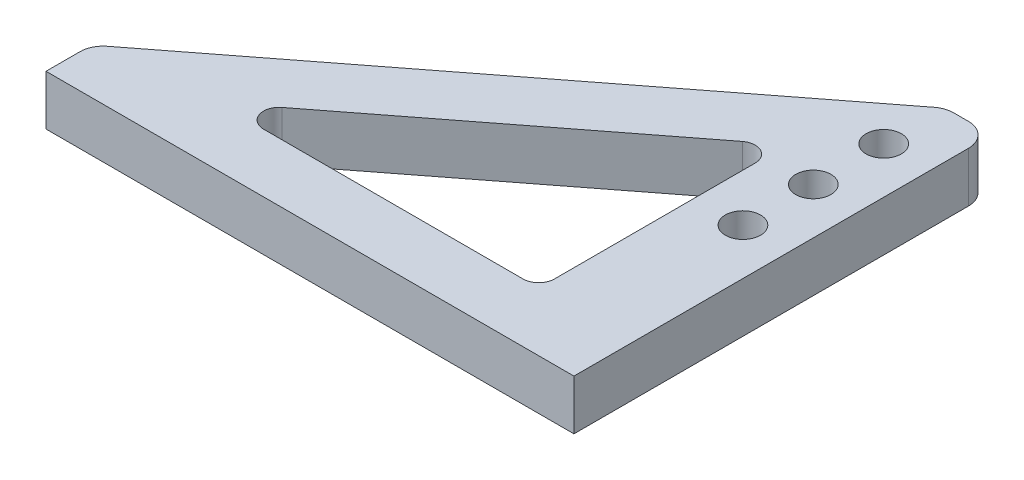
ISO-10303-21;
HEADER;
FILE_DESCRIPTION(('STEP AP214'),'2;1');
FILE_NAME('part.step','',(''),(''),'','','');
FILE_SCHEMA(('AUTOMOTIVE_DESIGN { 1 0 10303 214 1 1 1 1 }'));
ENDSEC;
DATA;
#1=APPLICATION_CONTEXT('core data for automotive mechanical design processes');
#2=APPLICATION_PROTOCOL_DEFINITION('international standard','automotive_design',2000,#1);
#3=PRODUCT_CONTEXT('',#1,'mechanical');
#4=PRODUCT('Part','Part','',(#3));
#5=PRODUCT_RELATED_PRODUCT_CATEGORY('part','',(#4));
#6=PRODUCT_DEFINITION_FORMATION('','',#4);
#7=PRODUCT_DEFINITION_CONTEXT('part definition',#1,'design');
#8=PRODUCT_DEFINITION('design','',#6,#7);
#9=PRODUCT_DEFINITION_SHAPE('','',#8);
#10=(LENGTH_UNIT() NAMED_UNIT(*) SI_UNIT(.MILLI.,.METRE.));
#11=(NAMED_UNIT(*) PLANE_ANGLE_UNIT() SI_UNIT($,.RADIAN.));
#12=(NAMED_UNIT(*) SI_UNIT($,.STERADIAN.) SOLID_ANGLE_UNIT());
#13=UNCERTAINTY_MEASURE_WITH_UNIT(LENGTH_MEASURE(1.E-05),#10,'distance_accuracy_value','');
#14=(GEOMETRIC_REPRESENTATION_CONTEXT(3) GLOBAL_UNCERTAINTY_ASSIGNED_CONTEXT((#13)) GLOBAL_UNIT_ASSIGNED_CONTEXT((#10,
#11,#12)) REPRESENTATION_CONTEXT('',''));
#15=CARTESIAN_POINT('',(0.,0.,0.));
#16=DIRECTION('',(0.,0.,1.));
#17=DIRECTION('',(1.,0.,0.));
#18=AXIS2_PLACEMENT_3D('',#15,#16,#17);
#19=CARTESIAN_POINT('',(19.05,1.6256,-13.5703377589833));
#20=DIRECTION('',(0.,-1.,0.));
#21=DIRECTION('',(0.,0.,-1.));
#22=AXIS2_PLACEMENT_3D('',#19,#20,#21);
#23=PLANE('',#22);
#24=CARTESIAN_POINT('',(17.5478505504094,1.6256,-9.27621674119706));
#25=DIRECTION('',(0.,1.,0.));
#26=DIRECTION('',(0.,0.,1.));
#27=AXIS2_PLACEMENT_3D('',#24,#25,#26);
#28=CIRCLE('',#27,0.571499999999999);
#29=CARTESIAN_POINT('',(17.5478505504094,1.6256,-8.70471674119706));
#30=VERTEX_POINT('',#29);
#31=EDGE_CURVE('E263',#30,#30,#28,.T.);
#32=ORIENTED_EDGE('',*,*,#31,.F.);
#33=EDGE_LOOP('',(#32));
#34=FACE_BOUND('',#33,.T.);
#35=DIRECTION('',(-0.791052984112555,0.,0.611747641047043));
#36=VECTOR('',#35,1.);
#37=CARTESIAN_POINT('',(5.57739124076499,1.6256,-1.905));
#38=LINE('',#37,#36);
#39=CARTESIAN_POINT('',(15.1832321983481,1.6256,-9.33351700719761));
#40=VERTEX_POINT('',#39);
#41=CARTESIAN_POINT('',(6.75392776998375,1.6256,-2.81485491592918));
#42=VERTEX_POINT('',#41);
#43=EDGE_CURVE('E245',#40,#42,#38,.T.);
#44=ORIENTED_EDGE('',*,*,#43,.F.);
#45=CARTESIAN_POINT('',(15.494,1.6256,-8.93166209126843));
#46=DIRECTION('',(0.,-1.,0.));
#47=DIRECTION('',(0.,0.,-1.));
#48=AXIS2_PLACEMENT_3D('',#45,#46,#47);
#49=CIRCLE('',#48,0.508);
#50=CARTESIAN_POINT('',(16.002,1.6256,-8.93166209126843));
#51=VERTEX_POINT('',#50);
#52=EDGE_CURVE('E200',#40,#51,#49,.T.);
#53=ORIENTED_EDGE('',*,*,#52,.T.);
#54=DIRECTION('',(0.,0.,-1.));
#55=VECTOR('',#54,1.);
#56=CARTESIAN_POINT('',(16.002,1.6256,-1.905));
#57=LINE('',#56,#55);
#58=CARTESIAN_POINT('',(16.002,1.6256,-2.413));
#59=VERTEX_POINT('',#58);
#60=EDGE_CURVE('E167',#59,#51,#57,.T.);
#61=ORIENTED_EDGE('',*,*,#60,.F.);
#62=CARTESIAN_POINT('',(15.494,1.6256,-2.413));
#63=DIRECTION('',(0.,-1.,0.));
#64=DIRECTION('',(0.,0.,-1.));
#65=AXIS2_PLACEMENT_3D('',#62,#63,#64);
#66=CIRCLE('',#65,0.508);
#67=CARTESIAN_POINT('',(15.494,1.6256,-1.905));
#68=VERTEX_POINT('',#67);
#69=EDGE_CURVE('E196',#59,#68,#66,.T.);
#70=ORIENTED_EDGE('',*,*,#69,.T.);
#71=DIRECTION('',(1.,0.,0.));
#72=VECTOR('',#71,1.);
#73=CARTESIAN_POINT('',(5.57739124076499,1.6256,-1.905));
#74=LINE('',#73,#72);
#75=CARTESIAN_POINT('',(7.06469557163565,1.6256,-1.905));
#76=VERTEX_POINT('',#75);
#77=EDGE_CURVE('E255',#76,#68,#74,.T.);
#78=ORIENTED_EDGE('',*,*,#77,.F.);
#79=CARTESIAN_POINT('',(7.06469557163565,1.6256,-2.413));
#80=DIRECTION('',(0.,-1.,0.));
#81=DIRECTION('',(0.,0.,-1.));
#82=AXIS2_PLACEMENT_3D('',#79,#80,#81);
#83=CIRCLE('',#82,0.508);
#84=EDGE_CURVE('E192',#76,#42,#83,.T.);
#85=ORIENTED_EDGE('',*,*,#84,.T.);
#86=EDGE_LOOP('',(#44,#53,#61,#70,#78,#85));
#87=FACE_BOUND('',#86,.T.);
#88=DIRECTION('',(-0.791052984112555,0.,0.611747641047043));
#89=VECTOR('',#88,1.);
#90=CARTESIAN_POINT('',(1.905,1.6256,-1.4732));
#91=LINE('',#90,#89);
#92=CARTESIAN_POINT('',(17.3419656890651,1.6256,-13.411120132877));
#93=VERTEX_POINT('',#92);
#94=CARTESIAN_POINT('',(2.20084829752215,1.6256,-1.7019893500838));
#95=VERTEX_POINT('',#94);
#96=EDGE_CURVE('E144',#93,#95,#91,.T.);
#97=ORIENTED_EDGE('',*,*,#96,.T.);
#98=CARTESIAN_POINT('',(2.667,1.6256,-1.09920697619003));
#99=DIRECTION('',(0.,-1.,0.));
#100=DIRECTION('',(0.,0.,-1.));
#101=AXIS2_PLACEMENT_3D('',#98,#99,#100);
#102=CIRCLE('',#101,0.762);
#103=CARTESIAN_POINT('',(1.905,1.6256,-1.09920697619003));
#104=VERTEX_POINT('',#103);
#105=EDGE_CURVE('E140',#95,#104,#102,.F.);
#106=ORIENTED_EDGE('',*,*,#105,.T.);
#107=DIRECTION('',(0.,0.,1.));
#108=VECTOR('',#107,1.);
#109=CARTESIAN_POINT('',(1.905,1.6256,0.));
#110=LINE('',#109,#108);
#111=CARTESIAN_POINT('',(1.905,1.6256,0.));
#112=VERTEX_POINT('',#111);
#113=EDGE_CURVE('E132',#104,#112,#110,.T.);
#114=ORIENTED_EDGE('',*,*,#113,.T.);
#115=DIRECTION('',(1.,0.,0.));
#116=VECTOR('',#115,1.);
#117=CARTESIAN_POINT('',(1.905,1.6256,0.));
#118=LINE('',#117,#116);
#119=CARTESIAN_POINT('',(19.05,1.6256,0.));
#120=VERTEX_POINT('',#119);
#121=EDGE_CURVE('E137',#112,#120,#118,.T.);
#122=ORIENTED_EDGE('',*,*,#121,.T.);
#123=DIRECTION('',(0.,0.,-1.));
#124=VECTOR('',#123,1.);
#125=CARTESIAN_POINT('',(19.05,1.6256,0.));
#126=LINE('',#125,#124);
#127=CARTESIAN_POINT('',(19.05,1.6256,-12.8083377589833));
#128=VERTEX_POINT('',#127);
#129=EDGE_CURVE('E174',#120,#128,#126,.T.);
#130=ORIENTED_EDGE('',*,*,#129,.T.);
#131=CARTESIAN_POINT('',(18.288,1.6256,-12.8083377589833));
#132=DIRECTION('',(0.,-1.,0.));
#133=DIRECTION('',(0.,0.,-1.));
#134=AXIS2_PLACEMENT_3D('',#131,#132,#133);
#135=CIRCLE('',#134,0.762);
#136=CARTESIAN_POINT('',(18.288,1.6256,-13.5703377589833));
#137=VERTEX_POINT('',#136);
#138=EDGE_CURVE('E54',#128,#137,#135,.F.);
#139=ORIENTED_EDGE('',*,*,#138,.T.);
#140=DIRECTION('',(-1.,0.,0.));
#141=VECTOR('',#140,1.);
#142=CARTESIAN_POINT('',(17.5478505504094,1.6256,-13.5703377589833));
#143=LINE('',#142,#141);
#144=CARTESIAN_POINT('',(17.808117391543,1.6256,-13.5703377589833));
#145=VERTEX_POINT('',#144);
#146=EDGE_CURVE('E224',#137,#145,#143,.T.);
#147=ORIENTED_EDGE('',*,*,#146,.T.);
#148=CARTESIAN_POINT('',(17.808117391543,1.6256,-12.8083377589833));
#149=DIRECTION('',(0.,-1.,0.));
#150=DIRECTION('',(0.,0.,-1.));
#151=AXIS2_PLACEMENT_3D('',#148,#149,#150);
#152=CIRCLE('',#151,0.762);
#153=EDGE_CURVE('E216',#145,#93,#152,.F.);
#154=ORIENTED_EDGE('',*,*,#153,.T.);
#155=EDGE_LOOP('',(#97,#106,#114,#122,#130,#139,#147,#154));
#156=FACE_BOUND('',#155,.T.);
#157=CARTESIAN_POINT('',(17.5478505504094,1.6256,-11.5622167411971));
#158=DIRECTION('',(0.,1.,0.));
#159=DIRECTION('',(0.,0.,1.));
#160=AXIS2_PLACEMENT_3D('',#157,#158,#159);
#161=CIRCLE('',#160,0.571499999999999);
#162=CARTESIAN_POINT('',(17.5478505504094,1.6256,-10.9907167411971));
#163=VERTEX_POINT('',#162);
#164=EDGE_CURVE('E252',#163,#163,#161,.T.);
#165=ORIENTED_EDGE('',*,*,#164,.F.);
#166=EDGE_LOOP('',(#165));
#167=FACE_BOUND('',#166,.T.);
#168=CARTESIAN_POINT('',(17.5478505504094,1.6256,-6.99021674119706));
#169=DIRECTION('',(0.,1.,0.));
#170=DIRECTION('',(0.,0.,1.));
#171=AXIS2_PLACEMENT_3D('',#168,#169,#170);
#172=CIRCLE('',#171,0.571499999999999);
#173=CARTESIAN_POINT('',(17.5478505504094,1.6256,-6.41871674119706));
#174=VERTEX_POINT('',#173);
#175=EDGE_CURVE('E269',#174,#174,#172,.T.);
#176=ORIENTED_EDGE('',*,*,#175,.F.);
#177=EDGE_LOOP('',(#176));
#178=FACE_BOUND('',#177,.T.);
#179=ADVANCED_FACE('F33',(#34,#87,#156,#167,#178),#23,.F.);
#180=CARTESIAN_POINT('',(19.05,0.,-13.5703377589833));
#181=DIRECTION('',(0.,-1.,0.));
#182=DIRECTION('',(0.,0.,-1.));
#183=AXIS2_PLACEMENT_3D('',#180,#181,#182);
#184=PLANE('',#183);
#185=CARTESIAN_POINT('',(17.5478505504094,0.,-9.27621674119706));
#186=DIRECTION('',(0.,1.,0.));
#187=DIRECTION('',(0.,0.,1.));
#188=AXIS2_PLACEMENT_3D('',#185,#186,#187);
#189=CIRCLE('',#188,0.571499999999999);
#190=CARTESIAN_POINT('',(17.5478505504094,0.,-8.70471674119706));
#191=VERTEX_POINT('',#190);
#192=EDGE_CURVE('E266',#191,#191,#189,.T.);
#193=ORIENTED_EDGE('',*,*,#192,.T.);
#194=EDGE_LOOP('',(#193));
#195=FACE_BOUND('',#194,.T.);
#196=DIRECTION('',(1.,0.,0.));
#197=VECTOR('',#196,1.);
#198=CARTESIAN_POINT('',(5.57739124076499,0.,-1.905));
#199=LINE('',#198,#197);
#200=CARTESIAN_POINT('',(7.06469557163565,0.,-1.905));
#201=VERTEX_POINT('',#200);
#202=CARTESIAN_POINT('',(15.494,0.,-1.905));
#203=VERTEX_POINT('',#202);
#204=EDGE_CURVE('E246',#201,#203,#199,.T.);
#205=ORIENTED_EDGE('',*,*,#204,.T.);
#206=CARTESIAN_POINT('',(15.494,0.,-2.413));
#207=DIRECTION('',(0.,-1.,0.));
#208=DIRECTION('',(0.,0.,-1.));
#209=AXIS2_PLACEMENT_3D('',#206,#207,#208);
#210=CIRCLE('',#209,0.508);
#211=CARTESIAN_POINT('',(16.002,0.,-2.413));
#212=VERTEX_POINT('',#211);
#213=EDGE_CURVE('E194',#203,#212,#210,.F.);
#214=ORIENTED_EDGE('',*,*,#213,.T.);
#215=DIRECTION('',(0.,0.,-1.));
#216=VECTOR('',#215,1.);
#217=CARTESIAN_POINT('',(16.002,0.,-1.905));
#218=LINE('',#217,#216);
#219=CARTESIAN_POINT('',(16.002,0.,-8.93166209126843));
#220=VERTEX_POINT('',#219);
#221=EDGE_CURVE('E242',#212,#220,#218,.T.);
#222=ORIENTED_EDGE('',*,*,#221,.T.);
#223=CARTESIAN_POINT('',(15.494,0.,-8.93166209126843));
#224=DIRECTION('',(0.,-1.,0.));
#225=DIRECTION('',(0.,0.,-1.));
#226=AXIS2_PLACEMENT_3D('',#223,#224,#225);
#227=CIRCLE('',#226,0.508);
#228=CARTESIAN_POINT('',(15.1832321983481,0.,-9.33351700719761));
#229=VERTEX_POINT('',#228);
#230=EDGE_CURVE('E198',#220,#229,#227,.F.);
#231=ORIENTED_EDGE('',*,*,#230,.T.);
#232=DIRECTION('',(-0.791052984112555,0.,0.611747641047043));
#233=VECTOR('',#232,1.);
#234=CARTESIAN_POINT('',(5.57739124076499,0.,-1.905));
#235=LINE('',#234,#233);
#236=CARTESIAN_POINT('',(6.75392776998375,0.,-2.81485491592918));
#237=VERTEX_POINT('',#236);
#238=EDGE_CURVE('E249',#229,#237,#235,.T.);
#239=ORIENTED_EDGE('',*,*,#238,.T.);
#240=CARTESIAN_POINT('',(7.06469557163565,0.,-2.413));
#241=DIRECTION('',(0.,-1.,0.));
#242=DIRECTION('',(0.,0.,-1.));
#243=AXIS2_PLACEMENT_3D('',#240,#241,#242);
#244=CIRCLE('',#243,0.508);
#245=EDGE_CURVE('E190',#237,#201,#244,.F.);
#246=ORIENTED_EDGE('',*,*,#245,.T.);
#247=EDGE_LOOP('',(#205,#214,#222,#231,#239,#246));
#248=FACE_BOUND('',#247,.T.);
#249=DIRECTION('',(0.,0.,1.));
#250=VECTOR('',#249,1.);
#251=CARTESIAN_POINT('',(1.905,0.,0.));
#252=LINE('',#251,#250);
#253=CARTESIAN_POINT('',(1.905,0.,-1.09920697619003));
#254=VERTEX_POINT('',#253);
#255=CARTESIAN_POINT('',(1.905,0.,0.));
#256=VERTEX_POINT('',#255);
#257=EDGE_CURVE('E150',#254,#256,#252,.T.);
#258=ORIENTED_EDGE('',*,*,#257,.F.);
#259=CARTESIAN_POINT('',(2.667,0.,-1.09920697619003));
#260=DIRECTION('',(0.,-1.,0.));
#261=DIRECTION('',(0.,0.,-1.));
#262=AXIS2_PLACEMENT_3D('',#259,#260,#261);
#263=CIRCLE('',#262,0.762);
#264=CARTESIAN_POINT('',(2.20084829752215,0.,-1.7019893500838));
#265=VERTEX_POINT('',#264);
#266=EDGE_CURVE('E208',#254,#265,#263,.T.);
#267=ORIENTED_EDGE('',*,*,#266,.T.);
#268=DIRECTION('',(-0.791052984112555,0.,0.611747641047043));
#269=VECTOR('',#268,1.);
#270=CARTESIAN_POINT('',(1.905,0.,-1.4732));
#271=LINE('',#270,#269);
#272=CARTESIAN_POINT('',(17.3419656890651,0.,-13.411120132877));
#273=VERTEX_POINT('',#272);
#274=EDGE_CURVE('E169',#273,#265,#271,.T.);
#275=ORIENTED_EDGE('',*,*,#274,.F.);
#276=CARTESIAN_POINT('',(17.808117391543,0.,-12.8083377589833));
#277=DIRECTION('',(0.,-1.,0.));
#278=DIRECTION('',(0.,0.,-1.));
#279=AXIS2_PLACEMENT_3D('',#276,#277,#278);
#280=CIRCLE('',#279,0.762);
#281=CARTESIAN_POINT('',(17.808117391543,0.,-13.5703377589833));
#282=VERTEX_POINT('',#281);
#283=EDGE_CURVE('E206',#273,#282,#280,.T.);
#284=ORIENTED_EDGE('',*,*,#283,.T.);
#285=DIRECTION('',(-1.,0.,0.));
#286=VECTOR('',#285,1.);
#287=CARTESIAN_POINT('',(17.5478505504094,0.,-13.5703377589833));
#288=LINE('',#287,#286);
#289=CARTESIAN_POINT('',(18.288,0.,-13.5703377589833));
#290=VERTEX_POINT('',#289);
#291=EDGE_CURVE('E166',#290,#282,#288,.T.);
#292=ORIENTED_EDGE('',*,*,#291,.F.);
#293=CARTESIAN_POINT('',(18.288,0.,-12.8083377589833));
#294=DIRECTION('',(0.,-1.,0.));
#295=DIRECTION('',(0.,0.,-1.));
#296=AXIS2_PLACEMENT_3D('',#293,#294,#295);
#297=CIRCLE('',#296,0.762);
#298=CARTESIAN_POINT('',(19.05,0.,-12.8083377589833));
#299=VERTEX_POINT('',#298);
#300=EDGE_CURVE('E204',#290,#299,#297,.T.);
#301=ORIENTED_EDGE('',*,*,#300,.T.);
#302=DIRECTION('',(0.,0.,-1.));
#303=VECTOR('',#302,1.);
#304=CARTESIAN_POINT('',(19.05,0.,0.));
#305=LINE('',#304,#303);
#306=CARTESIAN_POINT('',(19.05,0.,0.));
#307=VERTEX_POINT('',#306);
#308=EDGE_CURVE('E163',#307,#299,#305,.T.);
#309=ORIENTED_EDGE('',*,*,#308,.F.);
#310=DIRECTION('',(1.,0.,0.));
#311=VECTOR('',#310,1.);
#312=CARTESIAN_POINT('',(1.905,0.,0.));
#313=LINE('',#312,#311);
#314=EDGE_CURVE('E173',#256,#307,#313,.T.);
#315=ORIENTED_EDGE('',*,*,#314,.F.);
#316=EDGE_LOOP('',(#258,#267,#275,#284,#292,#301,#309,#315));
#317=FACE_BOUND('',#316,.T.);
#318=CARTESIAN_POINT('',(17.5478505504094,0.,-11.5622167411971));
#319=DIRECTION('',(0.,1.,0.));
#320=DIRECTION('',(0.,0.,1.));
#321=AXIS2_PLACEMENT_3D('',#318,#319,#320);
#322=CIRCLE('',#321,0.571499999999999);
#323=CARTESIAN_POINT('',(17.5478505504094,0.,-10.9907167411971));
#324=VERTEX_POINT('',#323);
#325=EDGE_CURVE('E260',#324,#324,#322,.T.);
#326=ORIENTED_EDGE('',*,*,#325,.T.);
#327=EDGE_LOOP('',(#326));
#328=FACE_BOUND('',#327,.T.);
#329=CARTESIAN_POINT('',(17.5478505504094,0.,-6.99021674119706));
#330=DIRECTION('',(0.,1.,0.));
#331=DIRECTION('',(0.,0.,1.));
#332=AXIS2_PLACEMENT_3D('',#329,#330,#331);
#333=CIRCLE('',#332,0.571499999999999);
#334=CARTESIAN_POINT('',(17.5478505504094,0.,-6.41871674119706));
#335=VERTEX_POINT('',#334);
#336=EDGE_CURVE('E272',#335,#335,#333,.T.);
#337=ORIENTED_EDGE('',*,*,#336,.T.);
#338=EDGE_LOOP('',(#337));
#339=FACE_BOUND('',#338,.T.);
#340=ADVANCED_FACE('F227',(#195,#248,#317,#328,#339),#184,.T.);
#341=CARTESIAN_POINT('',(19.05,1.6256,0.));
#342=DIRECTION('',(-1.,0.,0.));
#343=DIRECTION('',(0.,0.,1.));
#344=AXIS2_PLACEMENT_3D('',#341,#342,#343);
#345=PLANE('',#344);
#346=ORIENTED_EDGE('',*,*,#308,.T.);
#347=DIRECTION('',(0.,-1.,0.));
#348=VECTOR('',#347,1.);
#349=CARTESIAN_POINT('',(19.05,1.6256,-12.8083377589833));
#350=LINE('',#349,#348);
#351=EDGE_CURVE('E11',#299,#128,#350,.F.);
#352=ORIENTED_EDGE('',*,*,#351,.T.);
#353=ORIENTED_EDGE('',*,*,#129,.F.);
#354=DIRECTION('',(0.,-1.,0.));
#355=VECTOR('',#354,1.);
#356=CARTESIAN_POINT('',(19.05,1.6256,0.));
#357=LINE('',#356,#355);
#358=EDGE_CURVE('E154',#120,#307,#357,.T.);
#359=ORIENTED_EDGE('',*,*,#358,.T.);
#360=EDGE_LOOP('',(#346,#352,#353,#359));
#361=FACE_BOUND('',#360,.T.);
#362=ADVANCED_FACE('F288',(#361),#345,.F.);
#363=CARTESIAN_POINT('',(17.5478505504094,1.6256,-13.5703377589833));
#364=DIRECTION('',(0.,0.,1.));
#365=DIRECTION('',(1.,0.,0.));
#366=AXIS2_PLACEMENT_3D('',#363,#364,#365);
#367=PLANE('',#366);
#368=ORIENTED_EDGE('',*,*,#291,.T.);
#369=DIRECTION('',(0.,-1.,0.));
#370=VECTOR('',#369,1.);
#371=CARTESIAN_POINT('',(17.808117391543,1.6256,-13.5703377589833));
#372=LINE('',#371,#370);
#373=EDGE_CURVE('E41',#282,#145,#372,.F.);
#374=ORIENTED_EDGE('',*,*,#373,.T.);
#375=ORIENTED_EDGE('',*,*,#146,.F.);
#376=DIRECTION('',(0.,-1.,0.));
#377=VECTOR('',#376,1.);
#378=CARTESIAN_POINT('',(18.288,1.6256,-13.5703377589833));
#379=LINE('',#378,#377);
#380=EDGE_CURVE('E219',#137,#290,#379,.T.);
#381=ORIENTED_EDGE('',*,*,#380,.T.);
#382=EDGE_LOOP('',(#368,#374,#375,#381));
#383=FACE_BOUND('',#382,.T.);
#384=ADVANCED_FACE('F223',(#383),#367,.F.);
#385=CARTESIAN_POINT('',(1.905,1.6256,-1.4732));
#386=DIRECTION('',(0.611747641047043,0.,0.791052984112555));
#387=DIRECTION('',(0.791052984112555,0.,-0.611747641047043));
#388=AXIS2_PLACEMENT_3D('',#385,#386,#387);
#389=PLANE('',#388);
#390=ORIENTED_EDGE('',*,*,#274,.T.);
#391=DIRECTION('',(0.,-1.,0.));
#392=VECTOR('',#391,1.);
#393=CARTESIAN_POINT('',(2.20084829752215,1.6256,-1.7019893500838));
#394=LINE('',#393,#392);
#395=EDGE_CURVE('E213',#265,#95,#394,.F.);
#396=ORIENTED_EDGE('',*,*,#395,.T.);
#397=ORIENTED_EDGE('',*,*,#96,.F.);
#398=DIRECTION('',(0.,-1.,0.));
#399=VECTOR('',#398,1.);
#400=CARTESIAN_POINT('',(17.3419656890651,1.6256,-13.411120132877));
#401=LINE('',#400,#399);
#402=EDGE_CURVE('E210',#93,#273,#401,.T.);
#403=ORIENTED_EDGE('',*,*,#402,.T.);
#404=EDGE_LOOP('',(#390,#396,#397,#403));
#405=FACE_BOUND('',#404,.T.);
#406=ADVANCED_FACE('F237',(#405),#389,.F.);
#407=CARTESIAN_POINT('',(1.905,1.6256,0.));
#408=DIRECTION('',(1.,0.,0.));
#409=DIRECTION('',(0.,0.,-1.));
#410=AXIS2_PLACEMENT_3D('',#407,#408,#409);
#411=PLANE('',#410);
#412=ORIENTED_EDGE('',*,*,#113,.F.);
#413=DIRECTION('',(0.,-1.,0.));
#414=VECTOR('',#413,1.);
#415=CARTESIAN_POINT('',(1.905,1.6256,-1.09920697619003));
#416=LINE('',#415,#414);
#417=EDGE_CURVE('E202',#104,#254,#416,.T.);
#418=ORIENTED_EDGE('',*,*,#417,.T.);
#419=ORIENTED_EDGE('',*,*,#257,.T.);
#420=DIRECTION('',(0.,-1.,0.));
#421=VECTOR('',#420,1.);
#422=CARTESIAN_POINT('',(1.905,1.6256,0.));
#423=LINE('',#422,#421);
#424=EDGE_CURVE('E147',#112,#256,#423,.T.);
#425=ORIENTED_EDGE('',*,*,#424,.F.);
#426=EDGE_LOOP('',(#412,#418,#419,#425));
#427=FACE_BOUND('',#426,.T.);
#428=ADVANCED_FACE('F148',(#427),#411,.F.);
#429=CARTESIAN_POINT('',(1.905,1.6256,0.));
#430=DIRECTION('',(0.,0.,-1.));
#431=DIRECTION('',(-1.,0.,0.));
#432=AXIS2_PLACEMENT_3D('',#429,#430,#431);
#433=PLANE('',#432);
#434=ORIENTED_EDGE('',*,*,#314,.T.);
#435=ORIENTED_EDGE('',*,*,#358,.F.);
#436=ORIENTED_EDGE('',*,*,#121,.F.);
#437=ORIENTED_EDGE('',*,*,#424,.T.);
#438=EDGE_LOOP('',(#434,#435,#436,#437));
#439=FACE_BOUND('',#438,.T.);
#440=ADVANCED_FACE('F156',(#439),#433,.F.);
#441=CARTESIAN_POINT('',(5.57739124076499,1.6256,-1.905));
#442=DIRECTION('',(0.611747641047043,0.,0.791052984112555));
#443=DIRECTION('',(0.791052984112555,0.,-0.611747641047043));
#444=AXIS2_PLACEMENT_3D('',#441,#442,#443);
#445=PLANE('',#444);
#446=ORIENTED_EDGE('',*,*,#43,.T.);
#447=DIRECTION('',(0.,-1.,0.));
#448=VECTOR('',#447,1.);
#449=CARTESIAN_POINT('',(6.75392776998375,0.,-2.81485491592918));
#450=LINE('',#449,#448);
#451=EDGE_CURVE('E177',#42,#237,#450,.T.);
#452=ORIENTED_EDGE('',*,*,#451,.T.);
#453=ORIENTED_EDGE('',*,*,#238,.F.);
#454=DIRECTION('',(0.,-1.,0.));
#455=VECTOR('',#454,1.);
#456=CARTESIAN_POINT('',(15.1832321983481,1.6256,-9.33351700719761));
#457=LINE('',#456,#455);
#458=EDGE_CURVE('E153',#229,#40,#457,.F.);
#459=ORIENTED_EDGE('',*,*,#458,.T.);
#460=EDGE_LOOP('',(#446,#452,#453,#459));
#461=FACE_BOUND('',#460,.T.);
#462=ADVANCED_FACE('F294',(#461),#445,.T.);
#463=CARTESIAN_POINT('',(5.57739124076499,1.6256,-1.905));
#464=DIRECTION('',(0.,0.,-1.));
#465=DIRECTION('',(-1.,0.,0.));
#466=AXIS2_PLACEMENT_3D('',#463,#464,#465);
#467=PLANE('',#466);
#468=ORIENTED_EDGE('',*,*,#204,.F.);
#469=DIRECTION('',(0.,-1.,0.));
#470=VECTOR('',#469,1.);
#471=CARTESIAN_POINT('',(7.06469557163565,1.6256,-1.905));
#472=LINE('',#471,#470);
#473=EDGE_CURVE('E183',#201,#76,#472,.F.);
#474=ORIENTED_EDGE('',*,*,#473,.T.);
#475=ORIENTED_EDGE('',*,*,#77,.T.);
#476=DIRECTION('',(0.,-1.,0.));
#477=VECTOR('',#476,1.);
#478=CARTESIAN_POINT('',(15.494,0.,-1.905));
#479=LINE('',#478,#477);
#480=EDGE_CURVE('E180',#68,#203,#479,.T.);
#481=ORIENTED_EDGE('',*,*,#480,.T.);
#482=EDGE_LOOP('',(#468,#474,#475,#481));
#483=FACE_BOUND('',#482,.T.);
#484=ADVANCED_FACE('F391',(#483),#467,.T.);
#485=CARTESIAN_POINT('',(16.002,1.6256,-1.905));
#486=DIRECTION('',(-1.,0.,0.));
#487=DIRECTION('',(0.,0.,1.));
#488=AXIS2_PLACEMENT_3D('',#485,#486,#487);
#489=PLANE('',#488);
#490=ORIENTED_EDGE('',*,*,#221,.F.);
#491=DIRECTION('',(0.,-1.,0.));
#492=VECTOR('',#491,1.);
#493=CARTESIAN_POINT('',(16.002,1.6256,-2.413));
#494=LINE('',#493,#492);
#495=EDGE_CURVE('E188',#212,#59,#494,.F.);
#496=ORIENTED_EDGE('',*,*,#495,.T.);
#497=ORIENTED_EDGE('',*,*,#60,.T.);
#498=DIRECTION('',(0.,-1.,0.));
#499=VECTOR('',#498,1.);
#500=CARTESIAN_POINT('',(16.002,0.,-8.93166209126843));
#501=LINE('',#500,#499);
#502=EDGE_CURVE('E185',#51,#220,#501,.T.);
#503=ORIENTED_EDGE('',*,*,#502,.T.);
#504=EDGE_LOOP('',(#490,#496,#497,#503));
#505=FACE_BOUND('',#504,.T.);
#506=ADVANCED_FACE('F399',(#505),#489,.T.);
#507=CARTESIAN_POINT('',(17.5478505504094,1.6256,-11.5622167411971));
#508=DIRECTION('',(0.,-1.,0.));
#509=DIRECTION('',(0.,0.,-1.));
#510=AXIS2_PLACEMENT_3D('',#507,#508,#509);
#511=CYLINDRICAL_SURFACE('',#510,0.571499999999999);
#512=ORIENTED_EDGE('',*,*,#164,.T.);
#513=EDGE_LOOP('',(#512));
#514=FACE_BOUND('',#513,.T.);
#515=ORIENTED_EDGE('',*,*,#325,.F.);
#516=EDGE_LOOP('',(#515));
#517=FACE_BOUND('',#516,.T.);
#518=ADVANCED_FACE('F407',(#514,#517),#511,.F.);
#519=CARTESIAN_POINT('',(17.5478505504094,1.6256,-9.27621674119706));
#520=DIRECTION('',(0.,-1.,0.));
#521=DIRECTION('',(0.,0.,-1.));
#522=AXIS2_PLACEMENT_3D('',#519,#520,#521);
#523=CYLINDRICAL_SURFACE('',#522,0.571499999999999);
#524=ORIENTED_EDGE('',*,*,#31,.T.);
#525=EDGE_LOOP('',(#524));
#526=FACE_BOUND('',#525,.T.);
#527=ORIENTED_EDGE('',*,*,#192,.F.);
#528=EDGE_LOOP('',(#527));
#529=FACE_BOUND('',#528,.T.);
#530=ADVANCED_FACE('F415',(#526,#529),#523,.F.);
#531=CARTESIAN_POINT('',(17.5478505504094,1.6256,-6.99021674119706));
#532=DIRECTION('',(0.,-1.,0.));
#533=DIRECTION('',(0.,0.,-1.));
#534=AXIS2_PLACEMENT_3D('',#531,#532,#533);
#535=CYLINDRICAL_SURFACE('',#534,0.571499999999999);
#536=ORIENTED_EDGE('',*,*,#175,.T.);
#537=EDGE_LOOP('',(#536));
#538=FACE_BOUND('',#537,.T.);
#539=ORIENTED_EDGE('',*,*,#336,.F.);
#540=EDGE_LOOP('',(#539));
#541=FACE_BOUND('',#540,.T.);
#542=ADVANCED_FACE('F278',(#538,#541),#535,.F.);
#543=CARTESIAN_POINT('',(7.06469557163565,1.6256,-2.413));
#544=DIRECTION('',(0.,1.,0.));
#545=DIRECTION('',(0.,0.,1.));
#546=AXIS2_PLACEMENT_3D('',#543,#544,#545);
#547=CYLINDRICAL_SURFACE('',#546,0.508);
#548=ORIENTED_EDGE('',*,*,#84,.F.);
#549=ORIENTED_EDGE('',*,*,#473,.F.);
#550=ORIENTED_EDGE('',*,*,#245,.F.);
#551=ORIENTED_EDGE('',*,*,#451,.F.);
#552=EDGE_LOOP('',(#548,#549,#550,#551));
#553=FACE_BOUND('',#552,.T.);
#554=ADVANCED_FACE('F308',(#553),#547,.F.);
#555=CARTESIAN_POINT('',(15.494,1.6256,-2.413));
#556=DIRECTION('',(0.,1.,0.));
#557=DIRECTION('',(0.,0.,1.));
#558=AXIS2_PLACEMENT_3D('',#555,#556,#557);
#559=CYLINDRICAL_SURFACE('',#558,0.508);
#560=ORIENTED_EDGE('',*,*,#69,.F.);
#561=ORIENTED_EDGE('',*,*,#495,.F.);
#562=ORIENTED_EDGE('',*,*,#213,.F.);
#563=ORIENTED_EDGE('',*,*,#480,.F.);
#564=EDGE_LOOP('',(#560,#561,#562,#563));
#565=FACE_BOUND('',#564,.T.);
#566=ADVANCED_FACE('F311',(#565),#559,.F.);
#567=CARTESIAN_POINT('',(15.494,1.6256,-8.93166209126843));
#568=DIRECTION('',(0.,1.,0.));
#569=DIRECTION('',(0.,0.,1.));
#570=AXIS2_PLACEMENT_3D('',#567,#568,#569);
#571=CYLINDRICAL_SURFACE('',#570,0.508);
#572=ORIENTED_EDGE('',*,*,#52,.F.);
#573=ORIENTED_EDGE('',*,*,#458,.F.);
#574=ORIENTED_EDGE('',*,*,#230,.F.);
#575=ORIENTED_EDGE('',*,*,#502,.F.);
#576=EDGE_LOOP('',(#572,#573,#574,#575));
#577=FACE_BOUND('',#576,.T.);
#578=ADVANCED_FACE('F315',(#577),#571,.F.);
#579=CARTESIAN_POINT('',(2.667,1.6256,-1.09920697619003));
#580=DIRECTION('',(0.,-1.,0.));
#581=DIRECTION('',(0.,0.,-1.));
#582=AXIS2_PLACEMENT_3D('',#579,#580,#581);
#583=CYLINDRICAL_SURFACE('',#582,0.762);
#584=ORIENTED_EDGE('',*,*,#105,.F.);
#585=ORIENTED_EDGE('',*,*,#395,.F.);
#586=ORIENTED_EDGE('',*,*,#266,.F.);
#587=ORIENTED_EDGE('',*,*,#417,.F.);
#588=EDGE_LOOP('',(#584,#585,#586,#587));
#589=FACE_BOUND('',#588,.T.);
#590=ADVANCED_FACE('F319',(#589),#583,.T.);
#591=CARTESIAN_POINT('',(17.808117391543,1.6256,-12.8083377589833));
#592=DIRECTION('',(0.,-1.,0.));
#593=DIRECTION('',(0.,0.,-1.));
#594=AXIS2_PLACEMENT_3D('',#591,#592,#593);
#595=CYLINDRICAL_SURFACE('',#594,0.762);
#596=ORIENTED_EDGE('',*,*,#153,.F.);
#597=ORIENTED_EDGE('',*,*,#373,.F.);
#598=ORIENTED_EDGE('',*,*,#283,.F.);
#599=ORIENTED_EDGE('',*,*,#402,.F.);
#600=EDGE_LOOP('',(#596,#597,#598,#599));
#601=FACE_BOUND('',#600,.T.);
#602=ADVANCED_FACE('F234',(#601),#595,.T.);
#603=CARTESIAN_POINT('',(18.288,1.6256,-12.8083377589833));
#604=DIRECTION('',(0.,-1.,0.));
#605=DIRECTION('',(0.,0.,-1.));
#606=AXIS2_PLACEMENT_3D('',#603,#604,#605);
#607=CYLINDRICAL_SURFACE('',#606,0.762);
#608=ORIENTED_EDGE('',*,*,#138,.F.);
#609=ORIENTED_EDGE('',*,*,#351,.F.);
#610=ORIENTED_EDGE('',*,*,#300,.F.);
#611=ORIENTED_EDGE('',*,*,#380,.F.);
#612=EDGE_LOOP('',(#608,#609,#610,#611));
#613=FACE_BOUND('',#612,.T.);
#614=ADVANCED_FACE('F35',(#613),#607,.T.);
#615=CLOSED_SHELL('',(#179,#340,#362,#384,#406,#428,#440,#462,#484,#506,#518,#530,#542,#554,
#566,#578,#590,#602,#614));
#616=MANIFOLD_SOLID_BREP('B2',#615);
#617=ADVANCED_BREP_SHAPE_REPRESENTATION('',(#18,#616),#14);
#618=SHAPE_DEFINITION_REPRESENTATION(#9,#617);
ENDSEC;
END-ISO-10303-21;
